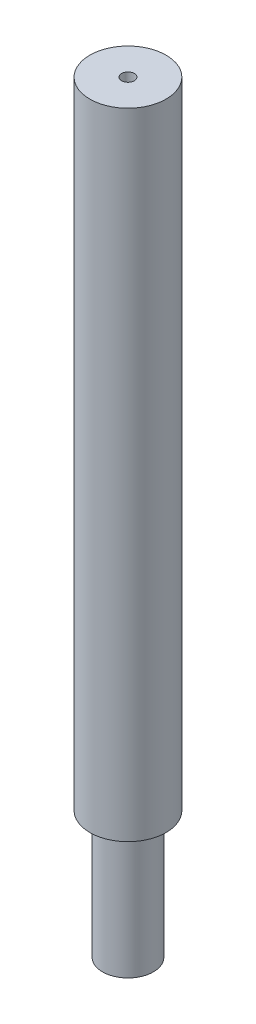
ISO-10303-21;
HEADER;
FILE_DESCRIPTION(('STEP AP214'),'2;1');
FILE_NAME('part.step','',(''),(''),'','','');
FILE_SCHEMA(('AUTOMOTIVE_DESIGN { 1 0 10303 214 1 1 1 1 }'));
ENDSEC;
DATA;
#1=APPLICATION_CONTEXT('core data for automotive mechanical design processes');
#2=APPLICATION_PROTOCOL_DEFINITION('international standard','automotive_design',2000,#1);
#3=PRODUCT_CONTEXT('',#1,'mechanical');
#4=PRODUCT('Part','Part','',(#3));
#5=PRODUCT_RELATED_PRODUCT_CATEGORY('part','',(#4));
#6=PRODUCT_DEFINITION_FORMATION('','',#4);
#7=PRODUCT_DEFINITION_CONTEXT('part definition',#1,'design');
#8=PRODUCT_DEFINITION('design','',#6,#7);
#9=PRODUCT_DEFINITION_SHAPE('','',#8);
#10=(LENGTH_UNIT() NAMED_UNIT(*) SI_UNIT(.MILLI.,.METRE.));
#11=(NAMED_UNIT(*) PLANE_ANGLE_UNIT() SI_UNIT($,.RADIAN.));
#12=(NAMED_UNIT(*) SI_UNIT($,.STERADIAN.) SOLID_ANGLE_UNIT());
#13=UNCERTAINTY_MEASURE_WITH_UNIT(LENGTH_MEASURE(1.E-05),#10,'distance_accuracy_value','');
#14=(GEOMETRIC_REPRESENTATION_CONTEXT(3) GLOBAL_UNCERTAINTY_ASSIGNED_CONTEXT((#13)) GLOBAL_UNIT_ASSIGNED_CONTEXT((#10,
#11,#12)) REPRESENTATION_CONTEXT('',''));
#15=CARTESIAN_POINT('',(0.,0.,0.));
#16=DIRECTION('',(0.,0.,1.));
#17=DIRECTION('',(1.,0.,0.));
#18=AXIS2_PLACEMENT_3D('',#15,#16,#17);
#19=CARTESIAN_POINT('',(0.,12.7,0.));
#20=DIRECTION('',(0.,-1.,0.));
#21=DIRECTION('',(0.,0.,-1.));
#22=AXIS2_PLACEMENT_3D('',#19,#20,#21);
#23=CYLINDRICAL_SURFACE('',#22,2.54);
#24=CARTESIAN_POINT('',(0.,12.7,0.));
#25=DIRECTION('',(0.,1.,0.));
#26=DIRECTION('',(0.,0.,1.));
#27=AXIS2_PLACEMENT_3D('',#24,#25,#26);
#28=CIRCLE('',#27,2.54);
#29=CARTESIAN_POINT('',(0.,12.7,2.54));
#30=VERTEX_POINT('',#29);
#31=EDGE_CURVE('E10',#30,#30,#28,.T.);
#32=ORIENTED_EDGE('',*,*,#31,.F.);
#33=EDGE_LOOP('',(#32));
#34=FACE_BOUND('',#33,.T.);
#35=CARTESIAN_POINT('',(0.,0.,0.));
#36=DIRECTION('',(0.,1.,0.));
#37=DIRECTION('',(0.,0.,1.));
#38=AXIS2_PLACEMENT_3D('',#35,#36,#37);
#39=CIRCLE('',#38,2.54);
#40=CARTESIAN_POINT('',(0.,0.,2.54));
#41=VERTEX_POINT('',#40);
#42=EDGE_CURVE('E33',#41,#41,#39,.T.);
#43=ORIENTED_EDGE('',*,*,#42,.T.);
#44=EDGE_LOOP('',(#43));
#45=FACE_BOUND('',#44,.T.);
#46=ADVANCED_FACE('F30',(#34,#45),#23,.T.);
#47=CARTESIAN_POINT('',(0.,0.,0.));
#48=DIRECTION('',(0.,1.,0.));
#49=DIRECTION('',(0.,0.,1.));
#50=AXIS2_PLACEMENT_3D('',#47,#48,#49);
#51=PLANE('',#50);
#52=CARTESIAN_POINT('',(0.,0.,0.));
#53=DIRECTION('',(0.,1.,0.));
#54=DIRECTION('',(0.,0.,1.));
#55=AXIS2_PLACEMENT_3D('',#52,#53,#54);
#56=CIRCLE('',#55,0.635);
#57=CARTESIAN_POINT('',(0.,0.,0.635));
#58=VERTEX_POINT('',#57);
#59=EDGE_CURVE('E45',#58,#58,#56,.T.);
#60=ORIENTED_EDGE('',*,*,#59,.T.);
#61=EDGE_LOOP('',(#60));
#62=FACE_BOUND('',#61,.T.);
#63=ORIENTED_EDGE('',*,*,#42,.F.);
#64=EDGE_LOOP('',(#63));
#65=FACE_BOUND('',#64,.T.);
#66=ADVANCED_FACE('F54',(#62,#65),#51,.F.);
#67=CARTESIAN_POINT('',(0.,76.2,0.));
#68=DIRECTION('',(0.,-1.,0.));
#69=DIRECTION('',(0.,0.,-1.));
#70=AXIS2_PLACEMENT_3D('',#67,#68,#69);
#71=CYLINDRICAL_SURFACE('',#70,3.81);
#72=CARTESIAN_POINT('',(0.,76.2,0.));
#73=DIRECTION('',(0.,1.,0.));
#74=DIRECTION('',(0.,0.,1.));
#75=AXIS2_PLACEMENT_3D('',#72,#73,#74);
#76=CIRCLE('',#75,3.81);
#77=CARTESIAN_POINT('',(0.,76.2,3.81));
#78=VERTEX_POINT('',#77);
#79=EDGE_CURVE('E40',#78,#78,#76,.T.);
#80=ORIENTED_EDGE('',*,*,#79,.F.);
#81=EDGE_LOOP('',(#80));
#82=FACE_BOUND('',#81,.T.);
#83=CARTESIAN_POINT('',(0.,12.7,0.));
#84=DIRECTION('',(0.,1.,0.));
#85=DIRECTION('',(0.,0.,1.));
#86=AXIS2_PLACEMENT_3D('',#83,#84,#85);
#87=CIRCLE('',#86,3.81);
#88=CARTESIAN_POINT('',(0.,12.7,3.81));
#89=VERTEX_POINT('',#88);
#90=EDGE_CURVE('E42',#89,#89,#87,.T.);
#91=ORIENTED_EDGE('',*,*,#90,.T.);
#92=EDGE_LOOP('',(#91));
#93=FACE_BOUND('',#92,.T.);
#94=ADVANCED_FACE('F67',(#82,#93),#71,.T.);
#95=CARTESIAN_POINT('',(0.,76.2,0.));
#96=DIRECTION('',(0.,1.,0.));
#97=DIRECTION('',(0.,0.,1.));
#98=AXIS2_PLACEMENT_3D('',#95,#96,#97);
#99=PLANE('',#98);
#100=CARTESIAN_POINT('',(0.,76.2,0.));
#101=DIRECTION('',(0.,1.,0.));
#102=DIRECTION('',(0.,0.,1.));
#103=AXIS2_PLACEMENT_3D('',#100,#101,#102);
#104=CIRCLE('',#103,0.635);
#105=CARTESIAN_POINT('',(0.,76.2,0.635));
#106=VERTEX_POINT('',#105);
#107=EDGE_CURVE('E48',#106,#106,#104,.T.);
#108=ORIENTED_EDGE('',*,*,#107,.F.);
#109=EDGE_LOOP('',(#108));
#110=FACE_BOUND('',#109,.T.);
#111=ORIENTED_EDGE('',*,*,#79,.T.);
#112=EDGE_LOOP('',(#111));
#113=FACE_BOUND('',#112,.T.);
#114=ADVANCED_FACE('F64',(#110,#113),#99,.T.);
#115=CARTESIAN_POINT('',(0.,12.7,0.));
#116=DIRECTION('',(0.,1.,0.));
#117=DIRECTION('',(0.,0.,1.));
#118=AXIS2_PLACEMENT_3D('',#115,#116,#117);
#119=PLANE('',#118);
#120=ORIENTED_EDGE('',*,*,#31,.T.);
#121=EDGE_LOOP('',(#120));
#122=FACE_BOUND('',#121,.T.);
#123=ORIENTED_EDGE('',*,*,#90,.F.);
#124=EDGE_LOOP('',(#123));
#125=FACE_BOUND('',#124,.T.);
#126=ADVANCED_FACE('F60',(#122,#125),#119,.F.);
#127=CARTESIAN_POINT('',(0.,0.,0.));
#128=DIRECTION('',(0.,1.,0.));
#129=DIRECTION('',(0.,0.,1.));
#130=AXIS2_PLACEMENT_3D('',#127,#128,#129);
#131=CYLINDRICAL_SURFACE('',#130,0.635);
#132=ORIENTED_EDGE('',*,*,#59,.F.);
#133=EDGE_LOOP('',(#132));
#134=FACE_BOUND('',#133,.T.);
#135=ORIENTED_EDGE('',*,*,#107,.T.);
#136=EDGE_LOOP('',(#135));
#137=FACE_BOUND('',#136,.T.);
#138=ADVANCED_FACE('F57',(#134,#137),#131,.F.);
#139=CLOSED_SHELL('',(#46,#66,#94,#114,#126,#138));
#140=MANIFOLD_SOLID_BREP('B2',#139);
#141=ADVANCED_BREP_SHAPE_REPRESENTATION('',(#18,#140),#14);
#142=SHAPE_DEFINITION_REPRESENTATION(#9,#141);
ENDSEC;
END-ISO-10303-21;
